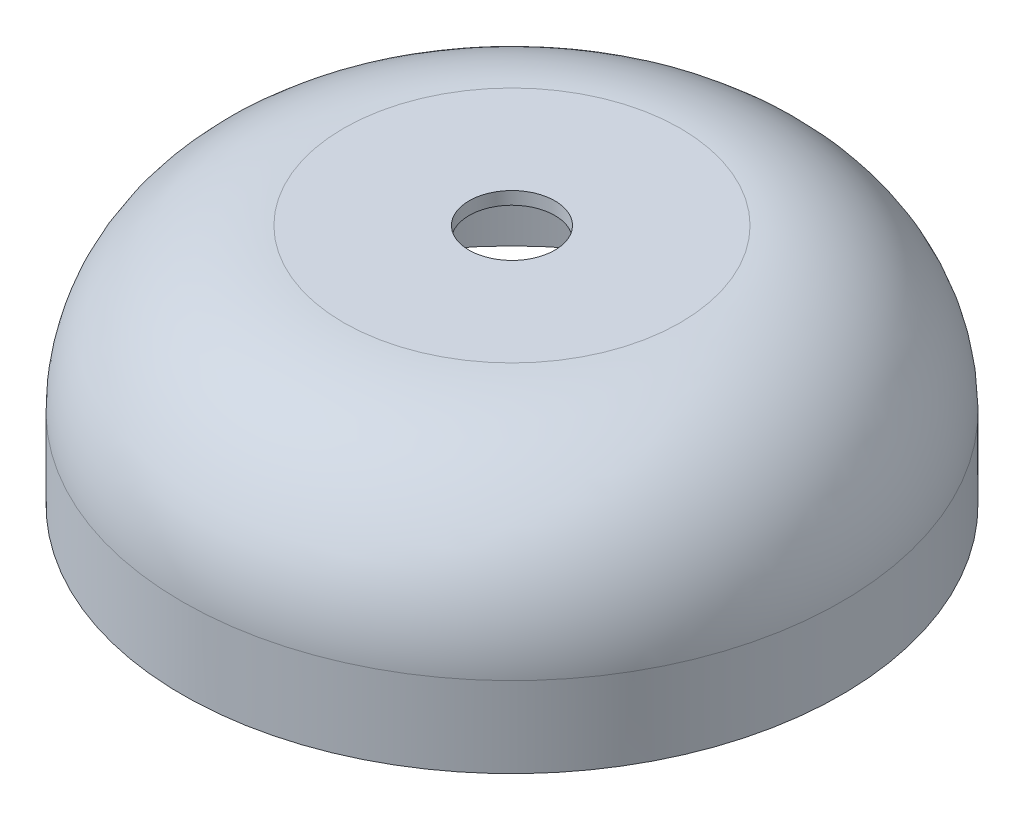
ISO-10303-21;
HEADER;
FILE_DESCRIPTION(('STEP AP214'),'2;1');
FILE_NAME('part.step','',(''),(''),'','','');
FILE_SCHEMA(('AUTOMOTIVE_DESIGN { 1 0 10303 214 1 1 1 1 }'));
ENDSEC;
DATA;
#1=APPLICATION_CONTEXT('core data for automotive mechanical design processes');
#2=APPLICATION_PROTOCOL_DEFINITION('international standard','automotive_design',2000,#1);
#3=PRODUCT_CONTEXT('',#1,'mechanical');
#4=PRODUCT('Part','Part','',(#3));
#5=PRODUCT_RELATED_PRODUCT_CATEGORY('part','',(#4));
#6=PRODUCT_DEFINITION_FORMATION('','',#4);
#7=PRODUCT_DEFINITION_CONTEXT('part definition',#1,'design');
#8=PRODUCT_DEFINITION('design','',#6,#7);
#9=PRODUCT_DEFINITION_SHAPE('','',#8);
#10=(LENGTH_UNIT() NAMED_UNIT(*) SI_UNIT(.MILLI.,.METRE.));
#11=(NAMED_UNIT(*) PLANE_ANGLE_UNIT() SI_UNIT($,.RADIAN.));
#12=(NAMED_UNIT(*) SI_UNIT($,.STERADIAN.) SOLID_ANGLE_UNIT());
#13=UNCERTAINTY_MEASURE_WITH_UNIT(LENGTH_MEASURE(1.E-05),#10,'distance_accuracy_value','');
#14=(GEOMETRIC_REPRESENTATION_CONTEXT(3) GLOBAL_UNCERTAINTY_ASSIGNED_CONTEXT((#13)) GLOBAL_UNIT_ASSIGNED_CONTEXT((#10,
#11,#12)) REPRESENTATION_CONTEXT('',''));
#15=CARTESIAN_POINT('',(0.,0.,0.));
#16=DIRECTION('',(0.,0.,1.));
#17=DIRECTION('',(1.,0.,0.));
#18=AXIS2_PLACEMENT_3D('',#15,#16,#17);
#19=CARTESIAN_POINT('',(0.,28.5,0.));
#20=DIRECTION('',(0.,-1.,0.));
#21=DIRECTION('',(0.,0.,-1.));
#22=AXIS2_PLACEMENT_3D('',#19,#20,#21);
#23=CYLINDRICAL_SURFACE('',#22,38.85);
#24=CARTESIAN_POINT('',(0.,9.49999999999999,0.));
#25=DIRECTION('',(0.,1.,0.));
#26=DIRECTION('',(0.,0.,1.));
#27=AXIS2_PLACEMENT_3D('',#24,#25,#26);
#28=CIRCLE('',#27,38.85);
#29=CARTESIAN_POINT('',(0.,9.49999999999999,-38.85));
#30=VERTEX_POINT('',#29);
#31=EDGE_CURVE('E10',#30,#30,#28,.F.);
#32=CARTESIAN_POINT('',(0.,0.,0.));
#33=DIRECTION('',(0.,1.,0.));
#34=DIRECTION('',(0.,0.,1.));
#35=AXIS2_PLACEMENT_3D('',#32,#33,#34);
#36=CIRCLE('',#35,38.85);
#37=CARTESIAN_POINT('',(0.,0.,-38.85));
#38=VERTEX_POINT('',#37);
#39=EDGE_CURVE('E43',#38,#38,#36,.T.);
#40=CARTESIAN_POINT('',(0.,9.49999999999999,-38.85));
#41=CARTESIAN_POINT('',(0.,9.40104166666666,-38.85));
#42=CARTESIAN_POINT('',(0.,9.30208333333333,-38.85));
#43=CARTESIAN_POINT('',(0.,9.10416666666666,-38.85));
#44=CARTESIAN_POINT('',(0.,9.00520833333333,-38.85));
#45=CARTESIAN_POINT('',(0.,8.80729166666666,-38.85));
#46=CARTESIAN_POINT('',(0.,8.70833333333333,-38.85));
#47=CARTESIAN_POINT('',(0.,8.51041666666666,-38.85));
#48=CARTESIAN_POINT('',(0.,8.41145833333333,-38.85));
#49=CARTESIAN_POINT('',(0.,8.21354166666666,-38.85));
#50=CARTESIAN_POINT('',(0.,8.11458333333333,-38.85));
#51=CARTESIAN_POINT('',(0.,7.91666666666666,-38.85));
#52=CARTESIAN_POINT('',(0.,7.81770833333333,-38.85));
#53=CARTESIAN_POINT('',(0.,7.61979166666666,-38.85));
#54=CARTESIAN_POINT('',(0.,7.52083333333333,-38.85));
#55=CARTESIAN_POINT('',(0.,7.32291666666666,-38.85));
#56=CARTESIAN_POINT('',(0.,7.22395833333333,-38.85));
#57=CARTESIAN_POINT('',(0.,7.02604166666666,-38.85));
#58=CARTESIAN_POINT('',(0.,6.92708333333333,-38.85));
#59=CARTESIAN_POINT('',(0.,6.72916666666666,-38.85));
#60=CARTESIAN_POINT('',(0.,6.63020833333333,-38.85));
#61=CARTESIAN_POINT('',(0.,6.43229166666666,-38.85));
#62=CARTESIAN_POINT('',(0.,6.33333333333333,-38.85));
#63=CARTESIAN_POINT('',(0.,6.13541666666666,-38.85));
#64=CARTESIAN_POINT('',(0.,6.03645833333333,-38.85));
#65=CARTESIAN_POINT('',(0.,5.83854166666666,-38.85));
#66=CARTESIAN_POINT('',(0.,5.73958333333333,-38.85));
#67=CARTESIAN_POINT('',(0.,5.54166666666666,-38.85));
#68=CARTESIAN_POINT('',(0.,5.44270833333333,-38.85));
#69=CARTESIAN_POINT('',(0.,5.24479166666667,-38.85));
#70=CARTESIAN_POINT('',(0.,5.14583333333333,-38.85));
#71=CARTESIAN_POINT('',(0.,4.94791666666667,-38.85));
#72=CARTESIAN_POINT('',(0.,4.84895833333333,-38.85));
#73=CARTESIAN_POINT('',(0.,4.65104166666666,-38.85));
#74=CARTESIAN_POINT('',(0.,4.55208333333333,-38.85));
#75=CARTESIAN_POINT('',(0.,4.35416666666666,-38.85));
#76=CARTESIAN_POINT('',(0.,4.25520833333333,-38.85));
#77=CARTESIAN_POINT('',(0.,4.05729166666666,-38.85));
#78=CARTESIAN_POINT('',(0.,3.95833333333333,-38.85));
#79=CARTESIAN_POINT('',(0.,3.76041666666666,-38.85));
#80=CARTESIAN_POINT('',(0.,3.66145833333333,-38.85));
#81=CARTESIAN_POINT('',(0.,3.46354166666666,-38.85));
#82=CARTESIAN_POINT('',(0.,3.36458333333333,-38.85));
#83=CARTESIAN_POINT('',(0.,3.16666666666666,-38.85));
#84=CARTESIAN_POINT('',(0.,3.06770833333333,-38.85));
#85=CARTESIAN_POINT('',(0.,2.86979166666667,-38.85));
#86=CARTESIAN_POINT('',(0.,2.77083333333333,-38.85));
#87=CARTESIAN_POINT('',(0.,2.57291666666666,-38.85));
#88=CARTESIAN_POINT('',(0.,2.47395833333333,-38.85));
#89=CARTESIAN_POINT('',(0.,2.27604166666667,-38.85));
#90=CARTESIAN_POINT('',(0.,2.17708333333333,-38.85));
#91=CARTESIAN_POINT('',(0.,1.97916666666667,-38.85));
#92=CARTESIAN_POINT('',(0.,1.88020833333333,-38.85));
#93=CARTESIAN_POINT('',(0.,1.68229166666667,-38.85));
#94=CARTESIAN_POINT('',(0.,1.58333333333333,-38.85));
#95=CARTESIAN_POINT('',(0.,1.38541666666667,-38.85));
#96=CARTESIAN_POINT('',(0.,1.28645833333333,-38.85));
#97=CARTESIAN_POINT('',(0.,1.08854166666667,-38.85));
#98=CARTESIAN_POINT('',(0.,0.989583333333333,-38.85));
#99=CARTESIAN_POINT('',(0.,0.791666666666666,-38.85));
#100=CARTESIAN_POINT('',(0.,0.692708333333333,-38.85));
#101=CARTESIAN_POINT('',(0.,0.494791666666668,-38.85));
#102=CARTESIAN_POINT('',(0.,0.395833333333335,-38.85));
#103=CARTESIAN_POINT('',(0.,0.197916666666668,-38.85));
#104=CARTESIAN_POINT('',(0.,0.098958333333334,-38.85));
#105=CARTESIAN_POINT('',(0.,0.,-38.85));
#106=B_SPLINE_CURVE_WITH_KNOTS('',3,(#40,#41,#42,#43,#44,#45,#46,#47,#48,#49,#50,#51,#52,#53,
#54,#55,#56,#57,#58,#59,#60,#61,#62,#63,#64,#65,#66,#67,#68,#69,#70,#71,#72,#73,#74,#75,#76,#77,
#78,#79,#80,#81,#82,#83,#84,#85,#86,#87,#88,#89,#90,#91,#92,#93,#94,#95,#96,#97,#98,#99,#100,
#101,#102,#103,#104,#105),.UNSPECIFIED.,.F.,.F.,(4,2,2,2,2,2,2,2,2,2,2,2,2,2,2,2,2,2,2,2,2,2,2,
2,2,2,2,2,2,2,2,2,4),(0.,0.296874999999999,0.593750000000001,0.890624999999999,1.1875,1.484375,
1.78125,2.078125,2.375,2.671875,2.96875,3.265625,3.5625,3.859375,4.15625,4.453125,4.75,5.046875,
5.34375,5.640625,5.9375,6.234375,6.53125,6.828125,7.125,7.42187499999999,7.71875,
8.01562499999999,8.31249999999999,8.60937499999999,8.90624999999999,9.20312499999999,
9.49999999999999),.UNSPECIFIED.);
#107=EDGE_CURVE('BSEAM31',#30,#38,#106,.T.);
#108=ORIENTED_EDGE('',*,*,#31,.T.);
#109=ORIENTED_EDGE('',*,*,#39,.T.);
#110=ORIENTED_EDGE('',*,*,#107,.T.);
#111=ORIENTED_EDGE('',*,*,#107,.F.);
#112=EDGE_LOOP('',(#108,#110,#109,#111));
#113=FACE_BOUND('',#112,.T.);
#114=ADVANCED_FACE('F31',(#113),#23,.T.);
#115=CARTESIAN_POINT('',(0.,28.5,0.));
#116=DIRECTION('',(0.,1.,0.));
#117=DIRECTION('',(0.,0.,1.));
#118=AXIS2_PLACEMENT_3D('',#115,#116,#117);
#119=PLANE('',#118);
#120=CARTESIAN_POINT('',(0.,28.5,0.));
#121=DIRECTION('',(0.,1.,0.));
#122=DIRECTION('',(0.,0.,1.));
#123=AXIS2_PLACEMENT_3D('',#120,#121,#122);
#124=CIRCLE('',#123,5.05);
#125=CARTESIAN_POINT('',(0.,28.5,5.05));
#126=VERTEX_POINT('',#125);
#127=EDGE_CURVE('E57',#126,#126,#124,.T.);
#128=ORIENTED_EDGE('',*,*,#127,.F.);
#129=EDGE_LOOP('',(#128));
#130=FACE_BOUND('',#129,.T.);
#131=CARTESIAN_POINT('',(0.,28.5,0.));
#132=DIRECTION('',(0.,1.,0.));
#133=DIRECTION('',(0.,0.,1.));
#134=AXIS2_PLACEMENT_3D('',#131,#132,#133);
#135=CIRCLE('',#134,19.85);
#136=CARTESIAN_POINT('',(0.,28.5,19.85));
#137=VERTEX_POINT('',#136);
#138=EDGE_CURVE('E39',#137,#137,#135,.T.);
#139=ORIENTED_EDGE('',*,*,#138,.T.);
#140=EDGE_LOOP('',(#139));
#141=FACE_BOUND('',#140,.T.);
#142=ADVANCED_FACE('F78',(#130,#141),#119,.T.);
#143=CARTESIAN_POINT('',(0.,0.,0.));
#144=DIRECTION('',(0.,1.,0.));
#145=DIRECTION('',(0.,0.,1.));
#146=AXIS2_PLACEMENT_3D('',#143,#144,#145);
#147=PLANE('',#146);
#148=CARTESIAN_POINT('',(0.,0.,0.));
#149=DIRECTION('',(0.,1.,0.));
#150=DIRECTION('',(0.,0.,1.));
#151=AXIS2_PLACEMENT_3D('',#148,#149,#150);
#152=CIRCLE('',#151,37.35);
#153=CARTESIAN_POINT('',(0.,0.,-37.35));
#154=VERTEX_POINT('',#153);
#155=EDGE_CURVE('E49',#154,#154,#152,.T.);
#156=ORIENTED_EDGE('',*,*,#155,.T.);
#157=EDGE_LOOP('',(#156));
#158=FACE_BOUND('',#157,.T.);
#159=ORIENTED_EDGE('',*,*,#39,.F.);
#160=EDGE_LOOP('',(#159));
#161=FACE_BOUND('',#160,.T.);
#162=ADVANCED_FACE('F82',(#158,#161),#147,.F.);
#163=CARTESIAN_POINT('',(0.,9.5,0.));
#164=DIRECTION('',(0.,1.,0.));
#165=DIRECTION('',(0.,0.,1.));
#166=AXIS2_PLACEMENT_3D('',#163,#164,#165);
#167=TOROIDAL_SURFACE('',#166,19.85,19.);
#168=ORIENTED_EDGE('',*,*,#31,.F.);
#169=EDGE_LOOP('',(#168));
#170=FACE_BOUND('',#169,.T.);
#171=ORIENTED_EDGE('',*,*,#138,.F.);
#172=EDGE_LOOP('',(#171));
#173=FACE_BOUND('',#172,.T.);
#174=ADVANCED_FACE('F33',(#170,#173),#167,.T.);
#175=CARTESIAN_POINT('',(0.,28.5,0.));
#176=DIRECTION('',(0.,-1.,0.));
#177=DIRECTION('',(0.,0.,-1.));
#178=AXIS2_PLACEMENT_3D('',#175,#176,#177);
#179=CYLINDRICAL_SURFACE('',#178,37.35);
#180=CARTESIAN_POINT('',(0.,9.5,0.));
#181=DIRECTION('',(0.,-1.,0.));
#182=DIRECTION('',(0.,0.,-1.));
#183=AXIS2_PLACEMENT_3D('',#180,#181,#182);
#184=CIRCLE('',#183,37.35);
#185=CARTESIAN_POINT('',(0.,9.5,-37.35));
#186=VERTEX_POINT('',#185);
#187=EDGE_CURVE('E48',#186,#186,#184,.T.);
#188=CARTESIAN_POINT('',(0.,9.5,-37.35));
#189=CARTESIAN_POINT('',(0.,9.40104166666667,-37.35));
#190=CARTESIAN_POINT('',(0.,9.30208333333334,-37.35));
#191=CARTESIAN_POINT('',(0.,9.10416666666667,-37.35));
#192=CARTESIAN_POINT('',(0.,9.00520833333334,-37.35));
#193=CARTESIAN_POINT('',(0.,8.80729166666667,-37.35));
#194=CARTESIAN_POINT('',(0.,8.70833333333334,-37.35));
#195=CARTESIAN_POINT('',(0.,8.51041666666667,-37.35));
#196=CARTESIAN_POINT('',(0.,8.41145833333334,-37.35));
#197=CARTESIAN_POINT('',(0.,8.21354166666667,-37.35));
#198=CARTESIAN_POINT('',(0.,8.11458333333333,-37.35));
#199=CARTESIAN_POINT('',(0.,7.91666666666667,-37.35));
#200=CARTESIAN_POINT('',(0.,7.81770833333333,-37.35));
#201=CARTESIAN_POINT('',(0.,7.61979166666667,-37.35));
#202=CARTESIAN_POINT('',(0.,7.52083333333333,-37.35));
#203=CARTESIAN_POINT('',(0.,7.32291666666667,-37.35));
#204=CARTESIAN_POINT('',(0.,7.22395833333333,-37.35));
#205=CARTESIAN_POINT('',(0.,7.02604166666667,-37.35));
#206=CARTESIAN_POINT('',(0.,6.92708333333333,-37.35));
#207=CARTESIAN_POINT('',(0.,6.72916666666667,-37.35));
#208=CARTESIAN_POINT('',(0.,6.63020833333333,-37.35));
#209=CARTESIAN_POINT('',(0.,6.43229166666667,-37.35));
#210=CARTESIAN_POINT('',(0.,6.33333333333333,-37.35));
#211=CARTESIAN_POINT('',(0.,6.13541666666667,-37.35));
#212=CARTESIAN_POINT('',(0.,6.03645833333333,-37.35));
#213=CARTESIAN_POINT('',(0.,5.83854166666667,-37.35));
#214=CARTESIAN_POINT('',(0.,5.73958333333333,-37.35));
#215=CARTESIAN_POINT('',(0.,5.54166666666667,-37.35));
#216=CARTESIAN_POINT('',(0.,5.44270833333333,-37.35));
#217=CARTESIAN_POINT('',(0.,5.24479166666667,-37.35));
#218=CARTESIAN_POINT('',(0.,5.14583333333333,-37.35));
#219=CARTESIAN_POINT('',(0.,4.94791666666667,-37.35));
#220=CARTESIAN_POINT('',(0.,4.84895833333333,-37.35));
#221=CARTESIAN_POINT('',(0.,4.65104166666667,-37.35));
#222=CARTESIAN_POINT('',(0.,4.55208333333333,-37.35));
#223=CARTESIAN_POINT('',(0.,4.35416666666667,-37.35));
#224=CARTESIAN_POINT('',(0.,4.25520833333333,-37.35));
#225=CARTESIAN_POINT('',(0.,4.05729166666667,-37.35));
#226=CARTESIAN_POINT('',(0.,3.95833333333333,-37.35));
#227=CARTESIAN_POINT('',(0.,3.76041666666667,-37.35));
#228=CARTESIAN_POINT('',(0.,3.66145833333333,-37.35));
#229=CARTESIAN_POINT('',(0.,3.46354166666667,-37.35));
#230=CARTESIAN_POINT('',(0.,3.36458333333333,-37.35));
#231=CARTESIAN_POINT('',(0.,3.16666666666667,-37.35));
#232=CARTESIAN_POINT('',(0.,3.06770833333333,-37.35));
#233=CARTESIAN_POINT('',(0.,2.86979166666667,-37.35));
#234=CARTESIAN_POINT('',(0.,2.77083333333333,-37.35));
#235=CARTESIAN_POINT('',(0.,2.57291666666667,-37.35));
#236=CARTESIAN_POINT('',(0.,2.47395833333333,-37.35));
#237=CARTESIAN_POINT('',(0.,2.27604166666667,-37.35));
#238=CARTESIAN_POINT('',(0.,2.17708333333333,-37.35));
#239=CARTESIAN_POINT('',(0.,1.97916666666667,-37.35));
#240=CARTESIAN_POINT('',(0.,1.88020833333333,-37.35));
#241=CARTESIAN_POINT('',(0.,1.68229166666667,-37.35));
#242=CARTESIAN_POINT('',(0.,1.58333333333333,-37.35));
#243=CARTESIAN_POINT('',(0.,1.38541666666667,-37.35));
#244=CARTESIAN_POINT('',(0.,1.28645833333333,-37.35));
#245=CARTESIAN_POINT('',(0.,1.08854166666667,-37.35));
#246=CARTESIAN_POINT('',(0.,0.989583333333333,-37.35));
#247=CARTESIAN_POINT('',(0.,0.791666666666666,-37.35));
#248=CARTESIAN_POINT('',(0.,0.692708333333333,-37.35));
#249=CARTESIAN_POINT('',(0.,0.494791666666668,-37.35));
#250=CARTESIAN_POINT('',(0.,0.395833333333335,-37.35));
#251=CARTESIAN_POINT('',(0.,0.197916666666668,-37.35));
#252=CARTESIAN_POINT('',(0.,0.098958333333334,-37.35));
#253=CARTESIAN_POINT('',(0.,0.,-37.35));
#254=B_SPLINE_CURVE_WITH_KNOTS('',3,(#188,#189,#190,#191,#192,#193,#194,#195,#196,#197,#198,
#199,#200,#201,#202,#203,#204,#205,#206,#207,#208,#209,#210,#211,#212,#213,#214,#215,#216,#217,
#218,#219,#220,#221,#222,#223,#224,#225,#226,#227,#228,#229,#230,#231,#232,#233,#234,#235,#236,
#237,#238,#239,#240,#241,#242,#243,#244,#245,#246,#247,#248,#249,#250,#251,#252,#253),
.UNSPECIFIED.,.F.,.F.,(4,2,2,2,2,2,2,2,2,2,2,2,2,2,2,2,2,2,2,2,2,2,2,2,2,2,2,2,2,2,2,2,4),(0.,
0.296874999999999,0.593750000000001,0.890624999999999,1.1875,1.484375,1.78125,2.078125,2.375,
2.671875,2.96875,3.265625,3.5625,3.859375,4.15625,4.453125,4.75,5.046875,5.34375,5.640625,
5.9375,6.234375,6.53125,6.828125,7.125,7.421875,7.71875,8.015625,8.3125,8.609375,8.90625,
9.203125,9.5),.UNSPECIFIED.);
#255=EDGE_CURVE('BSEAM91',#186,#154,#254,.T.);
#256=ORIENTED_EDGE('',*,*,#187,.F.);
#257=ORIENTED_EDGE('',*,*,#155,.F.);
#258=ORIENTED_EDGE('',*,*,#255,.T.);
#259=ORIENTED_EDGE('',*,*,#255,.F.);
#260=EDGE_LOOP('',(#256,#258,#257,#259));
#261=FACE_BOUND('',#260,.T.);
#262=ADVANCED_FACE('F91',(#261),#179,.F.);
#263=CARTESIAN_POINT('',(0.,27.,0.));
#264=DIRECTION('',(0.,1.,0.));
#265=DIRECTION('',(0.,0.,1.));
#266=AXIS2_PLACEMENT_3D('',#263,#264,#265);
#267=PLANE('',#266);
#268=CARTESIAN_POINT('',(0.,27.,0.));
#269=DIRECTION('',(0.,1.,0.));
#270=DIRECTION('',(0.,0.,1.));
#271=AXIS2_PLACEMENT_3D('',#268,#269,#270);
#272=CIRCLE('',#271,5.05);
#273=CARTESIAN_POINT('',(0.,27.,5.05));
#274=VERTEX_POINT('',#273);
#275=EDGE_CURVE('E35',#274,#274,#272,.T.);
#276=ORIENTED_EDGE('',*,*,#275,.T.);
#277=EDGE_LOOP('',(#276));
#278=FACE_BOUND('',#277,.T.);
#279=CARTESIAN_POINT('',(0.,27.,0.));
#280=DIRECTION('',(0.,1.,0.));
#281=DIRECTION('',(0.,0.,1.));
#282=AXIS2_PLACEMENT_3D('',#279,#280,#281);
#283=CIRCLE('',#282,19.85);
#284=CARTESIAN_POINT('',(0.,27.,19.85));
#285=VERTEX_POINT('',#284);
#286=EDGE_CURVE('E52',#285,#285,#283,.T.);
#287=ORIENTED_EDGE('',*,*,#286,.F.);
#288=EDGE_LOOP('',(#287));
#289=FACE_BOUND('',#288,.T.);
#290=ADVANCED_FACE('F64',(#278,#289),#267,.F.);
#291=CARTESIAN_POINT('',(0.,9.5,0.));
#292=DIRECTION('',(0.,1.,0.));
#293=DIRECTION('',(0.,0.,1.));
#294=AXIS2_PLACEMENT_3D('',#291,#292,#293);
#295=TOROIDAL_SURFACE('',#294,19.85,17.5);
#296=ORIENTED_EDGE('',*,*,#187,.T.);
#297=EDGE_LOOP('',(#296));
#298=FACE_BOUND('',#297,.T.);
#299=ORIENTED_EDGE('',*,*,#286,.T.);
#300=EDGE_LOOP('',(#299));
#301=FACE_BOUND('',#300,.T.);
#302=ADVANCED_FACE('F69',(#298,#301),#295,.F.);
#303=CARTESIAN_POINT('',(0.,0.,0.));
#304=DIRECTION('',(0.,1.,0.));
#305=DIRECTION('',(0.,0.,1.));
#306=AXIS2_PLACEMENT_3D('',#303,#304,#305);
#307=CYLINDRICAL_SURFACE('',#306,5.05);
#308=CARTESIAN_POINT('',(0.,28.5,5.05));
#309=CARTESIAN_POINT('',(0.,28.484375,5.05));
#310=CARTESIAN_POINT('',(0.,28.46875,5.05));
#311=CARTESIAN_POINT('',(0.,28.4375,5.05));
#312=CARTESIAN_POINT('',(0.,28.421875,5.05));
#313=CARTESIAN_POINT('',(0.,28.390625,5.05));
#314=CARTESIAN_POINT('',(0.,28.375,5.05));
#315=CARTESIAN_POINT('',(0.,28.34375,5.05));
#316=CARTESIAN_POINT('',(0.,28.328125,5.05));
#317=CARTESIAN_POINT('',(0.,28.296875,5.05));
#318=CARTESIAN_POINT('',(0.,28.28125,5.05));
#319=CARTESIAN_POINT('',(0.,28.25,5.05));
#320=CARTESIAN_POINT('',(0.,28.234375,5.05));
#321=CARTESIAN_POINT('',(0.,28.203125,5.05));
#322=CARTESIAN_POINT('',(0.,28.1875,5.05));
#323=CARTESIAN_POINT('',(0.,28.15625,5.05));
#324=CARTESIAN_POINT('',(0.,28.140625,5.05));
#325=CARTESIAN_POINT('',(0.,28.109375,5.05));
#326=CARTESIAN_POINT('',(0.,28.09375,5.05));
#327=CARTESIAN_POINT('',(0.,28.0625,5.05));
#328=CARTESIAN_POINT('',(0.,28.046875,5.05));
#329=CARTESIAN_POINT('',(0.,28.015625,5.05));
#330=CARTESIAN_POINT('',(0.,28.,5.05));
#331=CARTESIAN_POINT('',(0.,27.96875,5.05));
#332=CARTESIAN_POINT('',(0.,27.953125,5.05));
#333=CARTESIAN_POINT('',(0.,27.921875,5.05));
#334=CARTESIAN_POINT('',(0.,27.90625,5.05));
#335=CARTESIAN_POINT('',(0.,27.875,5.05));
#336=CARTESIAN_POINT('',(0.,27.859375,5.05));
#337=CARTESIAN_POINT('',(0.,27.828125,5.05));
#338=CARTESIAN_POINT('',(0.,27.8125,5.05));
#339=CARTESIAN_POINT('',(0.,27.78125,5.05));
#340=CARTESIAN_POINT('',(0.,27.765625,5.05));
#341=CARTESIAN_POINT('',(0.,27.734375,5.05));
#342=CARTESIAN_POINT('',(0.,27.71875,5.05));
#343=CARTESIAN_POINT('',(0.,27.6875,5.05));
#344=CARTESIAN_POINT('',(0.,27.671875,5.05));
#345=CARTESIAN_POINT('',(0.,27.640625,5.05));
#346=CARTESIAN_POINT('',(0.,27.625,5.05));
#347=CARTESIAN_POINT('',(0.,27.59375,5.05));
#348=CARTESIAN_POINT('',(0.,27.578125,5.05));
#349=CARTESIAN_POINT('',(0.,27.546875,5.05));
#350=CARTESIAN_POINT('',(0.,27.53125,5.05));
#351=CARTESIAN_POINT('',(0.,27.5,5.05));
#352=CARTESIAN_POINT('',(0.,27.484375,5.05));
#353=CARTESIAN_POINT('',(0.,27.453125,5.05));
#354=CARTESIAN_POINT('',(0.,27.4375,5.05));
#355=CARTESIAN_POINT('',(0.,27.40625,5.05));
#356=CARTESIAN_POINT('',(0.,27.390625,5.05));
#357=CARTESIAN_POINT('',(0.,27.359375,5.05));
#358=CARTESIAN_POINT('',(0.,27.34375,5.05));
#359=CARTESIAN_POINT('',(0.,27.3125,5.05));
#360=CARTESIAN_POINT('',(0.,27.296875,5.05));
#361=CARTESIAN_POINT('',(0.,27.265625,5.05));
#362=CARTESIAN_POINT('',(0.,27.25,5.05));
#363=CARTESIAN_POINT('',(0.,27.21875,5.05));
#364=CARTESIAN_POINT('',(0.,27.203125,5.05));
#365=CARTESIAN_POINT('',(0.,27.171875,5.05));
#366=CARTESIAN_POINT('',(0.,27.15625,5.05));
#367=CARTESIAN_POINT('',(0.,27.125,5.05));
#368=CARTESIAN_POINT('',(0.,27.109375,5.05));
#369=CARTESIAN_POINT('',(0.,27.078125,5.05));
#370=CARTESIAN_POINT('',(0.,27.0625,5.05));
#371=CARTESIAN_POINT('',(0.,27.03125,5.05));
#372=CARTESIAN_POINT('',(0.,27.015625,5.05));
#373=CARTESIAN_POINT('',(0.,27.,5.05));
#374=B_SPLINE_CURVE_WITH_KNOTS('',3,(#308,#309,#310,#311,#312,#313,#314,#315,#316,#317,#318,
#319,#320,#321,#322,#323,#324,#325,#326,#327,#328,#329,#330,#331,#332,#333,#334,#335,#336,#337,
#338,#339,#340,#341,#342,#343,#344,#345,#346,#347,#348,#349,#350,#351,#352,#353,#354,#355,#356,
#357,#358,#359,#360,#361,#362,#363,#364,#365,#366,#367,#368,#369,#370,#371,#372,#373),
.UNSPECIFIED.,.F.,.F.,(4,2,2,2,2,2,2,2,2,2,2,2,2,2,2,2,2,2,2,2,2,2,2,2,2,2,2,2,2,2,2,2,4),(0.,
0.0468750000000018,0.0937500000000001,0.140624999999998,0.1875,0.234375000000002,0.28125,
0.328124999999999,0.375,0.421875000000002,0.46875,0.515624999999999,0.5625,0.609375000000002,
0.656250000000001,0.703124999999999,0.750000000000001,0.796875000000002,0.843750000000001,
0.890624999999999,0.937500000000001,0.984375000000003,1.03125,1.078125,1.125,1.171875,1.21875,
1.265625,1.3125,1.359375,1.40625,1.453125,1.5),.UNSPECIFIED.);
#375=EDGE_CURVE('BSEAM67',#126,#274,#374,.T.);
#376=ORIENTED_EDGE('',*,*,#127,.T.);
#377=ORIENTED_EDGE('',*,*,#275,.F.);
#378=ORIENTED_EDGE('',*,*,#375,.T.);
#379=ORIENTED_EDGE('',*,*,#375,.F.);
#380=EDGE_LOOP('',(#376,#378,#377,#379));
#381=FACE_BOUND('',#380,.T.);
#382=ADVANCED_FACE('F67',(#381),#307,.F.);
#383=CLOSED_SHELL('',(#114,#142,#162,#174,#262,#290,#302,#382));
#384=MANIFOLD_SOLID_BREP('B2',#383);
#385=ADVANCED_BREP_SHAPE_REPRESENTATION('',(#18,#384),#14);
#386=SHAPE_DEFINITION_REPRESENTATION(#9,#385);
ENDSEC;
END-ISO-10303-21;
